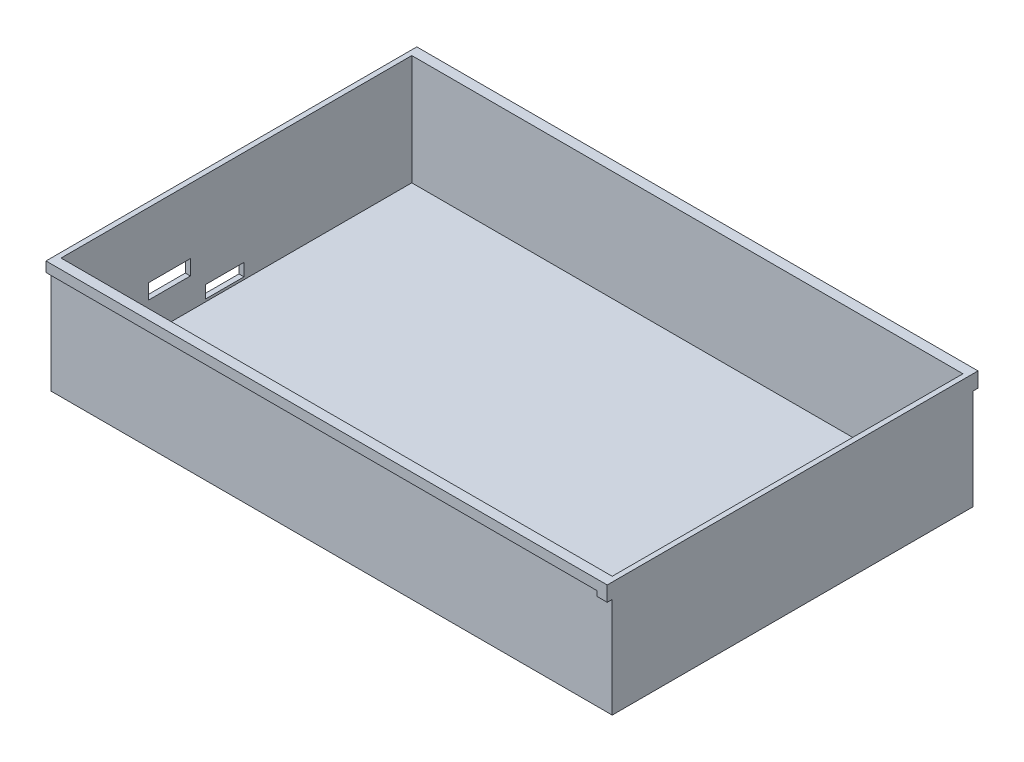
ISO-10303-21;
HEADER;
FILE_DESCRIPTION(('STEP AP214'),'2;1');
FILE_NAME('part.step','',(''),(''),'','','');
FILE_SCHEMA(('AUTOMOTIVE_DESIGN { 1 0 10303 214 1 1 1 1 }'));
ENDSEC;
DATA;
#1=APPLICATION_CONTEXT('core data for automotive mechanical design processes');
#2=APPLICATION_PROTOCOL_DEFINITION('international standard','automotive_design',2000,#1);
#3=PRODUCT_CONTEXT('',#1,'mechanical');
#4=PRODUCT('Part','Part','',(#3));
#5=PRODUCT_RELATED_PRODUCT_CATEGORY('part','',(#4));
#6=PRODUCT_DEFINITION_FORMATION('','',#4);
#7=PRODUCT_DEFINITION_CONTEXT('part definition',#1,'design');
#8=PRODUCT_DEFINITION('design','',#6,#7);
#9=PRODUCT_DEFINITION_SHAPE('','',#8);
#10=(LENGTH_UNIT() NAMED_UNIT(*) SI_UNIT(.MILLI.,.METRE.));
#11=(NAMED_UNIT(*) PLANE_ANGLE_UNIT() SI_UNIT($,.RADIAN.));
#12=(NAMED_UNIT(*) SI_UNIT($,.STERADIAN.) SOLID_ANGLE_UNIT());
#13=UNCERTAINTY_MEASURE_WITH_UNIT(LENGTH_MEASURE(1.E-05),#10,'distance_accuracy_value','');
#14=(GEOMETRIC_REPRESENTATION_CONTEXT(3) GLOBAL_UNCERTAINTY_ASSIGNED_CONTEXT((#13)) GLOBAL_UNIT_ASSIGNED_CONTEXT((#10,
#11,#12)) REPRESENTATION_CONTEXT('',''));
#15=CARTESIAN_POINT('',(0.,0.,0.));
#16=DIRECTION('',(0.,0.,1.));
#17=DIRECTION('',(1.,0.,0.));
#18=AXIS2_PLACEMENT_3D('',#15,#16,#17);
#19=CARTESIAN_POINT('',(0.,1.,0.));
#20=DIRECTION('',(0.,0.,-1.));
#21=DIRECTION('',(-1.,0.,0.));
#22=AXIS2_PLACEMENT_3D('',#19,#20,#21);
#23=PLANE('',#22);
#24=DIRECTION('',(1.,0.,0.));
#25=VECTOR('',#24,1.);
#26=CARTESIAN_POINT('',(112.,20.,0.));
#27=LINE('',#26,#25);
#28=CARTESIAN_POINT('',(110.,20.,0.));
#29=VERTEX_POINT('',#28);
#30=CARTESIAN_POINT('',(112.,20.,0.));
#31=VERTEX_POINT('',#30);
#32=EDGE_CURVE('E55',#29,#31,#27,.T.);
#33=ORIENTED_EDGE('',*,*,#32,.F.);
#34=DIRECTION('',(0.,-1.,0.));
#35=VECTOR('',#34,1.);
#36=CARTESIAN_POINT('',(110.,20.,0.));
#37=LINE('',#36,#35);
#38=CARTESIAN_POINT('',(110.,21.,0.));
#39=VERTEX_POINT('',#38);
#40=EDGE_CURVE('E242',#39,#29,#37,.T.);
#41=ORIENTED_EDGE('',*,*,#40,.F.);
#42=DIRECTION('',(1.,0.,0.));
#43=VECTOR('',#42,1.);
#44=CARTESIAN_POINT('',(110.,21.,0.));
#45=LINE('',#44,#43);
#46=CARTESIAN_POINT('',(0.,21.,0.));
#47=VERTEX_POINT('',#46);
#48=EDGE_CURVE('E61',#47,#39,#45,.T.);
#49=ORIENTED_EDGE('',*,*,#48,.F.);
#50=DIRECTION('',(0.,-1.,0.));
#51=VECTOR('',#50,1.);
#52=CARTESIAN_POINT('',(0.,1.,0.));
#53=LINE('',#52,#51);
#54=CARTESIAN_POINT('',(0.,0.,0.));
#55=VERTEX_POINT('',#54);
#56=EDGE_CURVE('E478',#47,#55,#53,.T.);
#57=ORIENTED_EDGE('',*,*,#56,.T.);
#58=DIRECTION('',(1.,0.,0.));
#59=VECTOR('',#58,1.);
#60=CARTESIAN_POINT('',(0.,0.,0.));
#61=LINE('',#60,#59);
#62=CARTESIAN_POINT('',(112.,0.,0.));
#63=VERTEX_POINT('',#62);
#64=EDGE_CURVE('E471',#55,#63,#61,.T.);
#65=ORIENTED_EDGE('',*,*,#64,.T.);
#66=DIRECTION('',(0.,-1.,0.));
#67=VECTOR('',#66,1.);
#68=CARTESIAN_POINT('',(112.,1.,0.));
#69=LINE('',#68,#67);
#70=EDGE_CURVE('E475',#31,#63,#69,.T.);
#71=ORIENTED_EDGE('',*,*,#70,.F.);
#72=EDGE_LOOP('',(#33,#41,#49,#57,#65,#71));
#73=FACE_BOUND('',#72,.T.);
#74=ADVANCED_FACE('F39',(#73),#23,.F.);
#75=CARTESIAN_POINT('',(1.,0.,0.));
#76=DIRECTION('',(1.,0.,0.));
#77=DIRECTION('',(0.,0.,-1.));
#78=AXIS2_PLACEMENT_3D('',#75,#76,#77);
#79=PLANE('',#78);
#80=DIRECTION('',(0.,0.,1.));
#81=VECTOR('',#80,1.);
#82=CARTESIAN_POINT('',(1.,1.50000000000001,0.));
#83=LINE('',#82,#81);
#84=CARTESIAN_POINT('',(1.,1.5,-37.5));
#85=VERTEX_POINT('',#84);
#86=CARTESIAN_POINT('',(1.,1.5,-29.8));
#87=VERTEX_POINT('',#86);
#88=EDGE_CURVE('E322',#85,#87,#83,.T.);
#89=ORIENTED_EDGE('',*,*,#88,.T.);
#90=DIRECTION('',(0.,1.,0.));
#91=VECTOR('',#90,1.);
#92=CARTESIAN_POINT('',(1.,0.,-29.8));
#93=LINE('',#92,#91);
#94=CARTESIAN_POINT('',(1.,4.,-29.8));
#95=VERTEX_POINT('',#94);
#96=EDGE_CURVE('E326',#87,#95,#93,.T.);
#97=ORIENTED_EDGE('',*,*,#96,.T.);
#98=DIRECTION('',(0.,0.,-1.));
#99=VECTOR('',#98,1.);
#100=CARTESIAN_POINT('',(1.,4.,0.));
#101=LINE('',#100,#99);
#102=CARTESIAN_POINT('',(1.,4.,-37.5));
#103=VERTEX_POINT('',#102);
#104=EDGE_CURVE('E331',#95,#103,#101,.T.);
#105=ORIENTED_EDGE('',*,*,#104,.T.);
#106=DIRECTION('',(0.,-1.,0.));
#107=VECTOR('',#106,1.);
#108=CARTESIAN_POINT('',(1.,0.,-37.5));
#109=LINE('',#108,#107);
#110=EDGE_CURVE('E335',#103,#85,#109,.T.);
#111=ORIENTED_EDGE('',*,*,#110,.T.);
#112=EDGE_LOOP('',(#89,#97,#105,#111));
#113=FACE_BOUND('',#112,.T.);
#114=DIRECTION('',(0.,0.,-1.));
#115=VECTOR('',#114,1.);
#116=CARTESIAN_POINT('',(1.,1.,0.));
#117=LINE('',#116,#115);
#118=CARTESIAN_POINT('',(1.,1.,-1.));
#119=VERTEX_POINT('',#118);
#120=CARTESIAN_POINT('',(1.,1.,-71.));
#121=VERTEX_POINT('',#120);
#122=EDGE_CURVE('E451',#119,#121,#117,.T.);
#123=ORIENTED_EDGE('',*,*,#122,.T.);
#124=DIRECTION('',(0.,1.,0.));
#125=VECTOR('',#124,1.);
#126=CARTESIAN_POINT('',(1.,0.,-71.));
#127=LINE('',#126,#125);
#128=CARTESIAN_POINT('',(1.,23.,-71.));
#129=VERTEX_POINT('',#128);
#130=EDGE_CURVE('E416',#121,#129,#127,.T.);
#131=ORIENTED_EDGE('',*,*,#130,.T.);
#132=DIRECTION('',(0.,0.,-1.));
#133=VECTOR('',#132,1.);
#134=CARTESIAN_POINT('',(1.,23.,0.));
#135=LINE('',#134,#133);
#136=CARTESIAN_POINT('',(1.,23.,-1.));
#137=VERTEX_POINT('',#136);
#138=EDGE_CURVE('E438',#137,#129,#135,.T.);
#139=ORIENTED_EDGE('',*,*,#138,.F.);
#140=DIRECTION('',(0.,1.,0.));
#141=VECTOR('',#140,1.);
#142=CARTESIAN_POINT('',(1.,0.,-1.));
#143=LINE('',#142,#141);
#144=EDGE_CURVE('E427',#119,#137,#143,.T.);
#145=ORIENTED_EDGE('',*,*,#144,.F.);
#146=EDGE_LOOP('',(#123,#131,#139,#145));
#147=FACE_BOUND('',#146,.T.);
#148=DIRECTION('',(0.,-1.,0.));
#149=VECTOR('',#148,1.);
#150=CARTESIAN_POINT('',(1.,0.,-18.5));
#151=LINE('',#150,#149);
#152=CARTESIAN_POINT('',(1.,10.,-18.5));
#153=VERTEX_POINT('',#152);
#154=CARTESIAN_POINT('',(1.,7.,-18.5));
#155=VERTEX_POINT('',#154);
#156=EDGE_CURVE('E379',#153,#155,#151,.T.);
#157=ORIENTED_EDGE('',*,*,#156,.F.);
#158=DIRECTION('',(0.,0.,1.));
#159=VECTOR('',#158,1.);
#160=CARTESIAN_POINT('',(1.,10.,0.));
#161=LINE('',#160,#159);
#162=CARTESIAN_POINT('',(1.,10.,-26.8));
#163=VERTEX_POINT('',#162);
#164=EDGE_CURVE('E368',#163,#153,#161,.T.);
#165=ORIENTED_EDGE('',*,*,#164,.F.);
#166=DIRECTION('',(0.,1.,0.));
#167=VECTOR('',#166,1.);
#168=CARTESIAN_POINT('',(1.,0.,-26.8));
#169=LINE('',#168,#167);
#170=CARTESIAN_POINT('',(1.,7.,-26.8));
#171=VERTEX_POINT('',#170);
#172=EDGE_CURVE('E371',#171,#163,#169,.T.);
#173=ORIENTED_EDGE('',*,*,#172,.F.);
#174=DIRECTION('',(0.,0.,-1.));
#175=VECTOR('',#174,1.);
#176=CARTESIAN_POINT('',(1.,7.,0.));
#177=LINE('',#176,#175);
#178=EDGE_CURVE('E375',#155,#171,#177,.T.);
#179=ORIENTED_EDGE('',*,*,#178,.F.);
#180=EDGE_LOOP('',(#157,#165,#173,#179));
#181=FACE_BOUND('',#180,.T.);
#182=ADVANCED_FACE('F505',(#113,#147,#181),#79,.T.);
#183=CARTESIAN_POINT('',(0.,1.,-72.));
#184=DIRECTION('',(1.,0.,0.));
#185=DIRECTION('',(0.,0.,-1.));
#186=AXIS2_PLACEMENT_3D('',#183,#184,#185);
#187=PLANE('',#186);
#188=DIRECTION('',(0.,0.,1.));
#189=VECTOR('',#188,1.);
#190=CARTESIAN_POINT('',(0.,21.,-73.));
#191=LINE('',#190,#189);
#192=CARTESIAN_POINT('',(0.,21.,-73.));
#193=VERTEX_POINT('',#192);
#194=CARTESIAN_POINT('',(0.,21.,-72.0067557104339));
#195=VERTEX_POINT('',#194);
#196=EDGE_CURVE('E296',#193,#195,#191,.T.);
#197=ORIENTED_EDGE('',*,*,#196,.T.);
#198=DIRECTION('',(0.,-0.999999948254399,0.000321700480205954));
#199=VECTOR('',#198,1.);
#200=CARTESIAN_POINT('',(0.,23.,-72.0073991114276));
#201=LINE('',#200,#199);
#202=CARTESIAN_POINT('',(0.,0.,-72.));
#203=VERTEX_POINT('',#202);
#204=EDGE_CURVE('E220',#195,#203,#201,.T.);
#205=ORIENTED_EDGE('',*,*,#204,.T.);
#206=DIRECTION('',(0.,0.,1.));
#207=VECTOR('',#206,1.);
#208=CARTESIAN_POINT('',(0.,0.,-72.));
#209=LINE('',#208,#207);
#210=EDGE_CURVE('E467',#203,#55,#209,.T.);
#211=ORIENTED_EDGE('',*,*,#210,.T.);
#212=ORIENTED_EDGE('',*,*,#56,.F.);
#213=DIRECTION('',(0.,0.,-1.));
#214=VECTOR('',#213,1.);
#215=CARTESIAN_POINT('',(0.,21.,1.));
#216=LINE('',#215,#214);
#217=CARTESIAN_POINT('',(0.,21.,1.));
#218=VERTEX_POINT('',#217);
#219=EDGE_CURVE('E229',#218,#47,#216,.T.);
#220=ORIENTED_EDGE('',*,*,#219,.F.);
#221=DIRECTION('',(0.,-1.,0.));
#222=VECTOR('',#221,1.);
#223=CARTESIAN_POINT('',(0.,21.,1.));
#224=LINE('',#223,#222);
#225=CARTESIAN_POINT('',(0.,23.,1.));
#226=VERTEX_POINT('',#225);
#227=EDGE_CURVE('E224',#226,#218,#224,.T.);
#228=ORIENTED_EDGE('',*,*,#227,.F.);
#229=DIRECTION('',(0.,0.,-1.));
#230=VECTOR('',#229,1.);
#231=CARTESIAN_POINT('',(0.,23.,0.));
#232=LINE('',#231,#230);
#233=CARTESIAN_POINT('',(0.,23.,-73.));
#234=VERTEX_POINT('',#233);
#235=EDGE_CURVE('E208',#226,#234,#232,.T.);
#236=ORIENTED_EDGE('',*,*,#235,.T.);
#237=DIRECTION('',(0.,-1.,0.));
#238=VECTOR('',#237,1.);
#239=CARTESIAN_POINT('',(0.,23.,-73.));
#240=LINE('',#239,#238);
#241=EDGE_CURVE('E281',#234,#193,#240,.T.);
#242=ORIENTED_EDGE('',*,*,#241,.T.);
#243=EDGE_LOOP('',(#197,#205,#211,#212,#220,#228,#236,#242));
#244=FACE_BOUND('',#243,.T.);
#245=DIRECTION('',(0.,1.,0.));
#246=VECTOR('',#245,1.);
#247=CARTESIAN_POINT('',(0.,0.,-29.8));
#248=LINE('',#247,#246);
#249=CARTESIAN_POINT('',(0.,1.5,-29.8));
#250=VERTEX_POINT('',#249);
#251=CARTESIAN_POINT('',(0.,4.,-29.8));
#252=VERTEX_POINT('',#251);
#253=EDGE_CURVE('E343',#250,#252,#248,.T.);
#254=ORIENTED_EDGE('',*,*,#253,.F.);
#255=DIRECTION('',(0.,0.,1.));
#256=VECTOR('',#255,1.);
#257=CARTESIAN_POINT('',(0.,1.50000000000001,0.));
#258=LINE('',#257,#256);
#259=CARTESIAN_POINT('',(0.,1.5,-37.5));
#260=VERTEX_POINT('',#259);
#261=EDGE_CURVE('E340',#260,#250,#258,.T.);
#262=ORIENTED_EDGE('',*,*,#261,.F.);
#263=DIRECTION('',(0.,-1.,0.));
#264=VECTOR('',#263,1.);
#265=CARTESIAN_POINT('',(0.,0.,-37.5));
#266=LINE('',#265,#264);
#267=CARTESIAN_POINT('',(0.,4.,-37.5));
#268=VERTEX_POINT('',#267);
#269=EDGE_CURVE('E327',#268,#260,#266,.T.);
#270=ORIENTED_EDGE('',*,*,#269,.F.);
#271=DIRECTION('',(0.,0.,-1.));
#272=VECTOR('',#271,1.);
#273=CARTESIAN_POINT('',(0.,4.,0.));
#274=LINE('',#273,#272);
#275=EDGE_CURVE('E348',#252,#268,#274,.T.);
#276=ORIENTED_EDGE('',*,*,#275,.F.);
#277=EDGE_LOOP('',(#254,#262,#270,#276));
#278=FACE_BOUND('',#277,.T.);
#279=DIRECTION('',(0.,0.,1.));
#280=VECTOR('',#279,1.);
#281=CARTESIAN_POINT('',(0.,10.,0.));
#282=LINE('',#281,#280);
#283=CARTESIAN_POINT('',(0.,10.,-26.8));
#284=VERTEX_POINT('',#283);
#285=CARTESIAN_POINT('',(0.,10.,-18.5));
#286=VERTEX_POINT('',#285);
#287=EDGE_CURVE('E321',#284,#286,#282,.T.);
#288=ORIENTED_EDGE('',*,*,#287,.T.);
#289=DIRECTION('',(0.,-1.,0.));
#290=VECTOR('',#289,1.);
#291=CARTESIAN_POINT('',(0.,0.,-18.5));
#292=LINE('',#291,#290);
#293=CARTESIAN_POINT('',(0.,7.,-18.5));
#294=VERTEX_POINT('',#293);
#295=EDGE_CURVE('E372',#286,#294,#292,.T.);
#296=ORIENTED_EDGE('',*,*,#295,.T.);
#297=DIRECTION('',(0.,0.,-1.));
#298=VECTOR('',#297,1.);
#299=CARTESIAN_POINT('',(0.,7.,0.));
#300=LINE('',#299,#298);
#301=CARTESIAN_POINT('',(0.,7.,-26.8));
#302=VERTEX_POINT('',#301);
#303=EDGE_CURVE('E390',#294,#302,#300,.T.);
#304=ORIENTED_EDGE('',*,*,#303,.T.);
#305=DIRECTION('',(0.,1.,0.));
#306=VECTOR('',#305,1.);
#307=CARTESIAN_POINT('',(0.,0.,-26.8));
#308=LINE('',#307,#306);
#309=EDGE_CURVE('E386',#302,#284,#308,.T.);
#310=ORIENTED_EDGE('',*,*,#309,.T.);
#311=EDGE_LOOP('',(#288,#296,#304,#310));
#312=FACE_BOUND('',#311,.T.);
#313=ADVANCED_FACE('F226',(#244,#278,#312),#187,.F.);
#314=CARTESIAN_POINT('',(0.,1.,0.));
#315=DIRECTION('',(0.,1.,0.));
#316=DIRECTION('',(0.,0.,1.));
#317=AXIS2_PLACEMENT_3D('',#314,#315,#316);
#318=PLANE('',#317);
#319=DIRECTION('',(0.,0.,1.));
#320=VECTOR('',#319,1.);
#321=CARTESIAN_POINT('',(111.,1.,0.));
#322=LINE('',#321,#320);
#323=CARTESIAN_POINT('',(111.,1.,-71.));
#324=VERTEX_POINT('',#323);
#325=CARTESIAN_POINT('',(111.,1.,-1.));
#326=VERTEX_POINT('',#325);
#327=EDGE_CURVE('E221',#324,#326,#322,.T.);
#328=ORIENTED_EDGE('',*,*,#327,.F.);
#329=DIRECTION('',(-1.,0.,0.));
#330=VECTOR('',#329,1.);
#331=CARTESIAN_POINT('',(0.,1.,-71.));
#332=LINE('',#331,#330);
#333=EDGE_CURVE('E412',#324,#121,#332,.T.);
#334=ORIENTED_EDGE('',*,*,#333,.T.);
#335=ORIENTED_EDGE('',*,*,#122,.F.);
#336=DIRECTION('',(-1.,0.,0.));
#337=VECTOR('',#336,1.);
#338=CARTESIAN_POINT('',(0.,1.,-1.));
#339=LINE('',#338,#337);
#340=EDGE_CURVE('E424',#326,#119,#339,.T.);
#341=ORIENTED_EDGE('',*,*,#340,.F.);
#342=EDGE_LOOP('',(#328,#334,#335,#341));
#343=FACE_BOUND('',#342,.T.);
#344=ADVANCED_FACE('F497',(#343),#318,.T.);
#345=CARTESIAN_POINT('',(111.,0.,0.));
#346=DIRECTION('',(-1.,0.,0.));
#347=DIRECTION('',(0.,0.,1.));
#348=AXIS2_PLACEMENT_3D('',#345,#346,#347);
#349=PLANE('',#348);
#350=DIRECTION('',(0.,0.,1.));
#351=VECTOR('',#350,1.);
#352=CARTESIAN_POINT('',(111.,23.,0.));
#353=LINE('',#352,#351);
#354=CARTESIAN_POINT('',(111.,23.,-71.));
#355=VERTEX_POINT('',#354);
#356=CARTESIAN_POINT('',(111.,23.,-1.));
#357=VERTEX_POINT('',#356);
#358=EDGE_CURVE('E431',#355,#357,#353,.T.);
#359=ORIENTED_EDGE('',*,*,#358,.F.);
#360=DIRECTION('',(0.,-1.,0.));
#361=VECTOR('',#360,1.);
#362=CARTESIAN_POINT('',(111.,0.,-71.));
#363=LINE('',#362,#361);
#364=EDGE_CURVE('E48',#355,#324,#363,.T.);
#365=ORIENTED_EDGE('',*,*,#364,.T.);
#366=ORIENTED_EDGE('',*,*,#327,.T.);
#367=DIRECTION('',(0.,-1.,0.));
#368=VECTOR('',#367,1.);
#369=CARTESIAN_POINT('',(111.,0.,-1.));
#370=LINE('',#369,#368);
#371=EDGE_CURVE('E484',#357,#326,#370,.T.);
#372=ORIENTED_EDGE('',*,*,#371,.F.);
#373=EDGE_LOOP('',(#359,#365,#366,#372));
#374=FACE_BOUND('',#373,.T.);
#375=ADVANCED_FACE('F492',(#374),#349,.T.);
#376=CARTESIAN_POINT('',(112.,1.,0.));
#377=DIRECTION('',(-1.,0.,0.));
#378=DIRECTION('',(0.,0.,1.));
#379=AXIS2_PLACEMENT_3D('',#376,#377,#378);
#380=PLANE('',#379);
#381=DIRECTION('',(0.,0.,1.));
#382=VECTOR('',#381,1.);
#383=CARTESIAN_POINT('',(112.,23.,0.));
#384=LINE('',#383,#382);
#385=CARTESIAN_POINT('',(112.,23.,-73.));
#386=VERTEX_POINT('',#385);
#387=CARTESIAN_POINT('',(112.,23.,1.));
#388=VERTEX_POINT('',#387);
#389=EDGE_CURVE('E430',#386,#388,#384,.T.);
#390=ORIENTED_EDGE('',*,*,#389,.T.);
#391=DIRECTION('',(0.,1.,0.));
#392=VECTOR('',#391,1.);
#393=CARTESIAN_POINT('',(112.,23.,1.));
#394=LINE('',#393,#392);
#395=CARTESIAN_POINT('',(112.,20.,1.));
#396=VERTEX_POINT('',#395);
#397=EDGE_CURVE('E238',#396,#388,#394,.T.);
#398=ORIENTED_EDGE('',*,*,#397,.F.);
#399=DIRECTION('',(0.,0.,-1.));
#400=VECTOR('',#399,1.);
#401=CARTESIAN_POINT('',(112.,20.,1.));
#402=LINE('',#401,#400);
#403=EDGE_CURVE('E255',#396,#31,#402,.T.);
#404=ORIENTED_EDGE('',*,*,#403,.T.);
#405=ORIENTED_EDGE('',*,*,#70,.T.);
#406=DIRECTION('',(0.,0.,-1.));
#407=VECTOR('',#406,1.);
#408=CARTESIAN_POINT('',(112.,0.,0.));
#409=LINE('',#408,#407);
#410=CARTESIAN_POINT('',(112.,0.,-72.));
#411=VERTEX_POINT('',#410);
#412=EDGE_CURVE('E459',#63,#411,#409,.T.);
#413=ORIENTED_EDGE('',*,*,#412,.T.);
#414=DIRECTION('',(0.,-1.,0.));
#415=VECTOR('',#414,1.);
#416=CARTESIAN_POINT('',(112.,1.,-72.));
#417=LINE('',#416,#415);
#418=CARTESIAN_POINT('',(112.,20.,-72.));
#419=VERTEX_POINT('',#418);
#420=EDGE_CURVE('E481',#419,#411,#417,.T.);
#421=ORIENTED_EDGE('',*,*,#420,.F.);
#422=DIRECTION('',(0.,0.,1.));
#423=VECTOR('',#422,1.);
#424=CARTESIAN_POINT('',(112.,20.,-73.));
#425=LINE('',#424,#423);
#426=CARTESIAN_POINT('',(112.,20.,-73.));
#427=VERTEX_POINT('',#426);
#428=EDGE_CURVE('E307',#427,#419,#425,.T.);
#429=ORIENTED_EDGE('',*,*,#428,.F.);
#430=DIRECTION('',(0.,1.,0.));
#431=VECTOR('',#430,1.);
#432=CARTESIAN_POINT('',(112.,20.,-73.));
#433=LINE('',#432,#431);
#434=EDGE_CURVE('E274',#427,#386,#433,.T.);
#435=ORIENTED_EDGE('',*,*,#434,.T.);
#436=EDGE_LOOP('',(#390,#398,#404,#405,#413,#421,#429,#435));
#437=FACE_BOUND('',#436,.T.);
#438=ADVANCED_FACE('F41',(#437),#380,.F.);
#439=CARTESIAN_POINT('',(112.,1.,-72.));
#440=DIRECTION('',(0.,0.,1.));
#441=DIRECTION('',(1.,0.,0.));
#442=AXIS2_PLACEMENT_3D('',#439,#440,#441);
#443=PLANE('',#442);
#444=DIRECTION('',(0.,-1.,0.));
#445=VECTOR('',#444,1.);
#446=CARTESIAN_POINT('',(110.,21.,-72.));
#447=LINE('',#446,#445);
#448=CARTESIAN_POINT('',(110.,21.,-72.));
#449=VERTEX_POINT('',#448);
#450=CARTESIAN_POINT('',(110.,20.,-72.));
#451=VERTEX_POINT('',#450);
#452=EDGE_CURVE('E300',#449,#451,#447,.T.);
#453=ORIENTED_EDGE('',*,*,#452,.T.);
#454=DIRECTION('',(1.,0.,0.));
#455=VECTOR('',#454,1.);
#456=CARTESIAN_POINT('',(110.,20.,-72.));
#457=LINE('',#456,#455);
#458=EDGE_CURVE('E278',#451,#419,#457,.T.);
#459=ORIENTED_EDGE('',*,*,#458,.T.);
#460=ORIENTED_EDGE('',*,*,#420,.T.);
#461=DIRECTION('',(-1.,0.,0.));
#462=VECTOR('',#461,1.);
#463=CARTESIAN_POINT('',(112.,0.,-72.));
#464=LINE('',#463,#462);
#465=CARTESIAN_POINT('',(1.00000000000003,0.,-72.));
#466=VERTEX_POINT('',#465);
#467=EDGE_CURVE('E463',#411,#466,#464,.T.);
#468=ORIENTED_EDGE('',*,*,#467,.T.);
#469=DIRECTION('',(0.,1.,0.));
#470=VECTOR('',#469,1.);
#471=CARTESIAN_POINT('',(1.,1.,-72.));
#472=LINE('',#471,#470);
#473=CARTESIAN_POINT('',(1.,21.,-72.));
#474=VERTEX_POINT('',#473);
#475=EDGE_CURVE('E455',#466,#474,#472,.T.);
#476=ORIENTED_EDGE('',*,*,#475,.T.);
#477=DIRECTION('',(1.,0.,0.));
#478=VECTOR('',#477,1.);
#479=CARTESIAN_POINT('',(0.,21.,-72.));
#480=LINE('',#479,#478);
#481=EDGE_CURVE('E273',#474,#449,#480,.T.);
#482=ORIENTED_EDGE('',*,*,#481,.T.);
#483=EDGE_LOOP('',(#453,#459,#460,#468,#476,#482));
#484=FACE_BOUND('',#483,.T.);
#485=ADVANCED_FACE('F533',(#484),#443,.F.);
#486=CARTESIAN_POINT('',(0.,0.,0.));
#487=DIRECTION('',(0.,1.,0.));
#488=DIRECTION('',(0.,0.,1.));
#489=AXIS2_PLACEMENT_3D('',#486,#487,#488);
#490=PLANE('',#489);
#491=ORIENTED_EDGE('',*,*,#467,.F.);
#492=ORIENTED_EDGE('',*,*,#412,.F.);
#493=ORIENTED_EDGE('',*,*,#64,.F.);
#494=ORIENTED_EDGE('',*,*,#210,.F.);
#495=DIRECTION('',(-1.,0.,0.));
#496=VECTOR('',#495,1.);
#497=CARTESIAN_POINT('',(1.,0.,-72.));
#498=LINE('',#497,#496);
#499=EDGE_CURVE('E444',#466,#203,#498,.T.);
#500=ORIENTED_EDGE('',*,*,#499,.F.);
#501=EDGE_LOOP('',(#491,#492,#493,#494,#500));
#502=FACE_BOUND('',#501,.T.);
#503=ADVANCED_FACE('F530',(#502),#490,.F.);
#504=DIRECTION('',(0.,0.,-1.));
#505=VECTOR('',#504,1.);
#506=CARTESIAN_POINT('',(1.,21.,0.));
#507=LINE('',#506,#505);
#508=CARTESIAN_POINT('',(1.,21.,-72.0067557104339));
#509=VERTEX_POINT('',#508);
#510=EDGE_CURVE('E310',#474,#509,#507,.T.);
#511=ORIENTED_EDGE('',*,*,#510,.F.);
#512=ORIENTED_EDGE('',*,*,#475,.F.);
#513=DIRECTION('',(0.,-0.999999948254399,0.000321700480205954));
#514=VECTOR('',#513,1.);
#515=CARTESIAN_POINT('',(1.,23.,-72.0073991114276));
#516=LINE('',#515,#514);
#517=EDGE_CURVE('E442',#509,#466,#516,.T.);
#518=ORIENTED_EDGE('',*,*,#517,.F.);
#519=EDGE_LOOP('',(#511,#512,#518));
#520=FACE_BOUND('',#519,.T.);
#521=ADVANCED_FACE('F527',(#520),#79,.T.);
#522=CARTESIAN_POINT('',(1.,23.,0.));
#523=DIRECTION('',(0.,1.,0.));
#524=DIRECTION('',(0.,0.,1.));
#525=AXIS2_PLACEMENT_3D('',#522,#523,#524);
#526=PLANE('',#525);
#527=DIRECTION('',(-1.,0.,0.));
#528=VECTOR('',#527,1.);
#529=CARTESIAN_POINT('',(112.,23.,-73.));
#530=LINE('',#529,#528);
#531=EDGE_CURVE('E215',#386,#234,#530,.T.);
#532=ORIENTED_EDGE('',*,*,#531,.T.);
#533=ORIENTED_EDGE('',*,*,#235,.F.);
#534=DIRECTION('',(-1.,0.,0.));
#535=VECTOR('',#534,1.);
#536=CARTESIAN_POINT('',(0.,23.,1.));
#537=LINE('',#536,#535);
#538=EDGE_CURVE('E213',#388,#226,#537,.T.);
#539=ORIENTED_EDGE('',*,*,#538,.F.);
#540=ORIENTED_EDGE('',*,*,#389,.F.);
#541=EDGE_LOOP('',(#532,#533,#539,#540));
#542=FACE_BOUND('',#541,.T.);
#543=ORIENTED_EDGE('',*,*,#138,.T.);
#544=DIRECTION('',(1.,0.,0.));
#545=VECTOR('',#544,1.);
#546=CARTESIAN_POINT('',(0.,23.,-71.));
#547=LINE('',#546,#545);
#548=EDGE_CURVE('E358',#129,#355,#547,.T.);
#549=ORIENTED_EDGE('',*,*,#548,.T.);
#550=ORIENTED_EDGE('',*,*,#358,.T.);
#551=DIRECTION('',(1.,0.,0.));
#552=VECTOR('',#551,1.);
#553=CARTESIAN_POINT('',(0.,23.,-1.));
#554=LINE('',#553,#552);
#555=EDGE_CURVE('E420',#137,#357,#554,.T.);
#556=ORIENTED_EDGE('',*,*,#555,.F.);
#557=EDGE_LOOP('',(#543,#549,#550,#556));
#558=FACE_BOUND('',#557,.T.);
#559=ADVANCED_FACE('F210',(#542,#558),#526,.T.);
#560=CARTESIAN_POINT('',(1.,23.,-72.0073991114276));
#561=DIRECTION('',(0.,-0.000321700480205954,-0.999999948254399));
#562=DIRECTION('',(0.,0.999999948254399,-0.000321700480205954));
#563=AXIS2_PLACEMENT_3D('',#560,#561,#562);
#564=PLANE('',#563);
#565=DIRECTION('',(-1.,0.,0.));
#566=VECTOR('',#565,1.);
#567=CARTESIAN_POINT('',(1.,21.,-72.0067557104339));
#568=LINE('',#567,#566);
#569=EDGE_CURVE('E11',#509,#195,#568,.T.);
#570=ORIENTED_EDGE('',*,*,#569,.F.);
#571=ORIENTED_EDGE('',*,*,#517,.T.);
#572=ORIENTED_EDGE('',*,*,#499,.T.);
#573=ORIENTED_EDGE('',*,*,#204,.F.);
#574=EDGE_LOOP('',(#570,#571,#572,#573));
#575=FACE_BOUND('',#574,.T.);
#576=ADVANCED_FACE('F518',(#575),#564,.T.);
#577=CARTESIAN_POINT('',(0.,0.,-1.));
#578=DIRECTION('',(0.,0.,-1.));
#579=DIRECTION('',(-1.,0.,0.));
#580=AXIS2_PLACEMENT_3D('',#577,#578,#579);
#581=PLANE('',#580);
#582=ORIENTED_EDGE('',*,*,#340,.T.);
#583=ORIENTED_EDGE('',*,*,#144,.T.);
#584=ORIENTED_EDGE('',*,*,#555,.T.);
#585=ORIENTED_EDGE('',*,*,#371,.T.);
#586=EDGE_LOOP('',(#582,#583,#584,#585));
#587=FACE_BOUND('',#586,.T.);
#588=ADVANCED_FACE('F501',(#587),#581,.T.);
#589=CARTESIAN_POINT('',(0.,0.,-71.));
#590=DIRECTION('',(0.,0.,-1.));
#591=DIRECTION('',(-1.,0.,0.));
#592=AXIS2_PLACEMENT_3D('',#589,#590,#591);
#593=PLANE('',#592);
#594=ORIENTED_EDGE('',*,*,#130,.F.);
#595=ORIENTED_EDGE('',*,*,#333,.F.);
#596=ORIENTED_EDGE('',*,*,#364,.F.);
#597=ORIENTED_EDGE('',*,*,#548,.F.);
#598=EDGE_LOOP('',(#594,#595,#596,#597));
#599=FACE_BOUND('',#598,.T.);
#600=ADVANCED_FACE('F507',(#599),#593,.F.);
#601=CARTESIAN_POINT('',(1.,10.,0.));
#602=DIRECTION('',(0.,-1.,0.));
#603=DIRECTION('',(0.,0.,-1.));
#604=AXIS2_PLACEMENT_3D('',#601,#602,#603);
#605=PLANE('',#604);
#606=ORIENTED_EDGE('',*,*,#287,.F.);
#607=DIRECTION('',(-1.,0.,0.));
#608=VECTOR('',#607,1.);
#609=CARTESIAN_POINT('',(1.,10.,-26.8));
#610=LINE('',#609,#608);
#611=EDGE_CURVE('E382',#163,#284,#610,.T.);
#612=ORIENTED_EDGE('',*,*,#611,.F.);
#613=ORIENTED_EDGE('',*,*,#164,.T.);
#614=DIRECTION('',(-1.,0.,0.));
#615=VECTOR('',#614,1.);
#616=CARTESIAN_POINT('',(1.,10.,-18.5));
#617=LINE('',#616,#615);
#618=EDGE_CURVE('E344',#153,#286,#617,.T.);
#619=ORIENTED_EDGE('',*,*,#618,.T.);
#620=EDGE_LOOP('',(#606,#612,#613,#619));
#621=FACE_BOUND('',#620,.T.);
#622=ADVANCED_FACE('F509',(#621),#605,.T.);
#623=CARTESIAN_POINT('',(1.,0.,-18.5));
#624=DIRECTION('',(0.,0.,-1.));
#625=DIRECTION('',(-1.,0.,0.));
#626=AXIS2_PLACEMENT_3D('',#623,#624,#625);
#627=PLANE('',#626);
#628=ORIENTED_EDGE('',*,*,#295,.F.);
#629=ORIENTED_EDGE('',*,*,#618,.F.);
#630=ORIENTED_EDGE('',*,*,#156,.T.);
#631=DIRECTION('',(-1.,0.,0.));
#632=VECTOR('',#631,1.);
#633=CARTESIAN_POINT('',(1.,7.,-18.5));
#634=LINE('',#633,#632);
#635=EDGE_CURVE('E400',#155,#294,#634,.T.);
#636=ORIENTED_EDGE('',*,*,#635,.T.);
#637=EDGE_LOOP('',(#628,#629,#630,#636));
#638=FACE_BOUND('',#637,.T.);
#639=ADVANCED_FACE('F515',(#638),#627,.T.);
#640=CARTESIAN_POINT('',(1.,7.,0.));
#641=DIRECTION('',(0.,1.,0.));
#642=DIRECTION('',(0.,0.,1.));
#643=AXIS2_PLACEMENT_3D('',#640,#641,#642);
#644=PLANE('',#643);
#645=ORIENTED_EDGE('',*,*,#303,.F.);
#646=ORIENTED_EDGE('',*,*,#635,.F.);
#647=ORIENTED_EDGE('',*,*,#178,.T.);
#648=DIRECTION('',(-1.,0.,0.));
#649=VECTOR('',#648,1.);
#650=CARTESIAN_POINT('',(1.,7.,-26.8));
#651=LINE('',#650,#649);
#652=EDGE_CURVE('E403',#171,#302,#651,.T.);
#653=ORIENTED_EDGE('',*,*,#652,.T.);
#654=EDGE_LOOP('',(#645,#646,#647,#653));
#655=FACE_BOUND('',#654,.T.);
#656=ADVANCED_FACE('F618',(#655),#644,.T.);
#657=CARTESIAN_POINT('',(1.,0.,-26.8));
#658=DIRECTION('',(0.,0.,1.));
#659=DIRECTION('',(1.,0.,0.));
#660=AXIS2_PLACEMENT_3D('',#657,#658,#659);
#661=PLANE('',#660);
#662=ORIENTED_EDGE('',*,*,#309,.F.);
#663=ORIENTED_EDGE('',*,*,#652,.F.);
#664=ORIENTED_EDGE('',*,*,#172,.T.);
#665=ORIENTED_EDGE('',*,*,#611,.T.);
#666=EDGE_LOOP('',(#662,#663,#664,#665));
#667=FACE_BOUND('',#666,.T.);
#668=ADVANCED_FACE('F614',(#667),#661,.T.);
#669=CARTESIAN_POINT('',(1.,1.50000000000001,0.));
#670=DIRECTION('',(0.,-1.,0.));
#671=DIRECTION('',(0.,0.,-1.));
#672=AXIS2_PLACEMENT_3D('',#669,#670,#671);
#673=PLANE('',#672);
#674=ORIENTED_EDGE('',*,*,#261,.T.);
#675=DIRECTION('',(-1.,0.,0.));
#676=VECTOR('',#675,1.);
#677=CARTESIAN_POINT('',(1.,1.5,-29.8));
#678=LINE('',#677,#676);
#679=EDGE_CURVE('E339',#87,#250,#678,.T.);
#680=ORIENTED_EDGE('',*,*,#679,.F.);
#681=ORIENTED_EDGE('',*,*,#88,.F.);
#682=DIRECTION('',(-1.,0.,0.));
#683=VECTOR('',#682,1.);
#684=CARTESIAN_POINT('',(1.,1.5,-37.5));
#685=LINE('',#684,#683);
#686=EDGE_CURVE('E355',#85,#260,#685,.T.);
#687=ORIENTED_EDGE('',*,*,#686,.T.);
#688=EDGE_LOOP('',(#674,#680,#681,#687));
#689=FACE_BOUND('',#688,.T.);
#690=ADVANCED_FACE('F604',(#689),#673,.F.);
#691=CARTESIAN_POINT('',(1.,0.,-37.5));
#692=DIRECTION('',(0.,0.,-1.));
#693=DIRECTION('',(-1.,0.,0.));
#694=AXIS2_PLACEMENT_3D('',#691,#692,#693);
#695=PLANE('',#694);
#696=ORIENTED_EDGE('',*,*,#269,.T.);
#697=ORIENTED_EDGE('',*,*,#686,.F.);
#698=ORIENTED_EDGE('',*,*,#110,.F.);
#699=DIRECTION('',(-1.,0.,0.));
#700=VECTOR('',#699,1.);
#701=CARTESIAN_POINT('',(1.,4.,-37.5));
#702=LINE('',#701,#700);
#703=EDGE_CURVE('E359',#103,#268,#702,.T.);
#704=ORIENTED_EDGE('',*,*,#703,.T.);
#705=EDGE_LOOP('',(#696,#697,#698,#704));
#706=FACE_BOUND('',#705,.T.);
#707=ADVANCED_FACE('F600',(#706),#695,.F.);
#708=CARTESIAN_POINT('',(1.,4.,0.));
#709=DIRECTION('',(0.,1.,0.));
#710=DIRECTION('',(0.,0.,1.));
#711=AXIS2_PLACEMENT_3D('',#708,#709,#710);
#712=PLANE('',#711);
#713=ORIENTED_EDGE('',*,*,#275,.T.);
#714=ORIENTED_EDGE('',*,*,#703,.F.);
#715=ORIENTED_EDGE('',*,*,#104,.F.);
#716=DIRECTION('',(-1.,0.,0.));
#717=VECTOR('',#716,1.);
#718=CARTESIAN_POINT('',(1.,4.,-29.8));
#719=LINE('',#718,#717);
#720=EDGE_CURVE('E362',#95,#252,#719,.T.);
#721=ORIENTED_EDGE('',*,*,#720,.T.);
#722=EDGE_LOOP('',(#713,#714,#715,#721));
#723=FACE_BOUND('',#722,.T.);
#724=ADVANCED_FACE('F603',(#723),#712,.F.);
#725=CARTESIAN_POINT('',(1.,0.,-29.8));
#726=DIRECTION('',(0.,0.,1.));
#727=DIRECTION('',(0.,-1.,0.));
#728=AXIS2_PLACEMENT_3D('',#725,#726,#727);
#729=PLANE('',#728);
#730=ORIENTED_EDGE('',*,*,#253,.T.);
#731=ORIENTED_EDGE('',*,*,#720,.F.);
#732=ORIENTED_EDGE('',*,*,#96,.F.);
#733=ORIENTED_EDGE('',*,*,#679,.T.);
#734=EDGE_LOOP('',(#730,#731,#732,#733));
#735=FACE_BOUND('',#734,.T.);
#736=ADVANCED_FACE('F595',(#735),#729,.F.);
#737=CARTESIAN_POINT('',(110.,20.,-73.));
#738=DIRECTION('',(0.,-1.,0.));
#739=DIRECTION('',(0.,0.,-1.));
#740=AXIS2_PLACEMENT_3D('',#737,#738,#739);
#741=PLANE('',#740);
#742=ORIENTED_EDGE('',*,*,#458,.F.);
#743=DIRECTION('',(0.,0.,1.));
#744=VECTOR('',#743,1.);
#745=CARTESIAN_POINT('',(110.,20.,-73.));
#746=LINE('',#745,#744);
#747=CARTESIAN_POINT('',(110.,20.,-73.));
#748=VERTEX_POINT('',#747);
#749=EDGE_CURVE('E311',#748,#451,#746,.T.);
#750=ORIENTED_EDGE('',*,*,#749,.F.);
#751=DIRECTION('',(1.,0.,0.));
#752=VECTOR('',#751,1.);
#753=CARTESIAN_POINT('',(110.,20.,-73.));
#754=LINE('',#753,#752);
#755=EDGE_CURVE('E292',#748,#427,#754,.T.);
#756=ORIENTED_EDGE('',*,*,#755,.T.);
#757=ORIENTED_EDGE('',*,*,#428,.T.);
#758=EDGE_LOOP('',(#742,#750,#756,#757));
#759=FACE_BOUND('',#758,.T.);
#760=ADVANCED_FACE('F550',(#759),#741,.T.);
#761=CARTESIAN_POINT('',(110.,21.,-73.));
#762=DIRECTION('',(-1.,0.,0.));
#763=DIRECTION('',(0.,0.,1.));
#764=AXIS2_PLACEMENT_3D('',#761,#762,#763);
#765=PLANE('',#764);
#766=ORIENTED_EDGE('',*,*,#452,.F.);
#767=DIRECTION('',(0.,0.,1.));
#768=VECTOR('',#767,1.);
#769=CARTESIAN_POINT('',(110.,21.,-73.));
#770=LINE('',#769,#768);
#771=CARTESIAN_POINT('',(110.,21.,-73.));
#772=VERTEX_POINT('',#771);
#773=EDGE_CURVE('E314',#772,#449,#770,.T.);
#774=ORIENTED_EDGE('',*,*,#773,.F.);
#775=DIRECTION('',(0.,-1.,0.));
#776=VECTOR('',#775,1.);
#777=CARTESIAN_POINT('',(110.,21.,-73.));
#778=LINE('',#777,#776);
#779=EDGE_CURVE('E288',#772,#748,#778,.T.);
#780=ORIENTED_EDGE('',*,*,#779,.T.);
#781=ORIENTED_EDGE('',*,*,#749,.T.);
#782=EDGE_LOOP('',(#766,#774,#780,#781));
#783=FACE_BOUND('',#782,.T.);
#784=ADVANCED_FACE('F546',(#783),#765,.T.);
#785=CARTESIAN_POINT('',(0.,21.,-73.));
#786=DIRECTION('',(0.,-1.,0.));
#787=DIRECTION('',(0.,0.,-1.));
#788=AXIS2_PLACEMENT_3D('',#785,#786,#787);
#789=PLANE('',#788);
#790=ORIENTED_EDGE('',*,*,#481,.F.);
#791=ORIENTED_EDGE('',*,*,#510,.T.);
#792=ORIENTED_EDGE('',*,*,#569,.T.);
#793=ORIENTED_EDGE('',*,*,#196,.F.);
#794=DIRECTION('',(1.,0.,0.));
#795=VECTOR('',#794,1.);
#796=CARTESIAN_POINT('',(0.,21.,-73.));
#797=LINE('',#796,#795);
#798=EDGE_CURVE('E284',#193,#772,#797,.T.);
#799=ORIENTED_EDGE('',*,*,#798,.T.);
#800=ORIENTED_EDGE('',*,*,#773,.T.);
#801=EDGE_LOOP('',(#790,#791,#792,#793,#799,#800));
#802=FACE_BOUND('',#801,.T.);
#803=ADVANCED_FACE('F592',(#802),#789,.T.);
#804=CARTESIAN_POINT('',(0.,0.,-73.));
#805=DIRECTION('',(0.,0.,1.));
#806=DIRECTION('',(1.,0.,0.));
#807=AXIS2_PLACEMENT_3D('',#804,#805,#806);
#808=PLANE('',#807);
#809=ORIENTED_EDGE('',*,*,#434,.F.);
#810=ORIENTED_EDGE('',*,*,#755,.F.);
#811=ORIENTED_EDGE('',*,*,#779,.F.);
#812=ORIENTED_EDGE('',*,*,#798,.F.);
#813=ORIENTED_EDGE('',*,*,#241,.F.);
#814=ORIENTED_EDGE('',*,*,#531,.F.);
#815=EDGE_LOOP('',(#809,#810,#811,#812,#813,#814));
#816=FACE_BOUND('',#815,.T.);
#817=ADVANCED_FACE('F553',(#816),#808,.F.);
#818=CARTESIAN_POINT('',(110.,21.,1.));
#819=DIRECTION('',(0.,1.,0.));
#820=DIRECTION('',(-1.,0.,0.));
#821=AXIS2_PLACEMENT_3D('',#818,#819,#820);
#822=PLANE('',#821);
#823=ORIENTED_EDGE('',*,*,#48,.T.);
#824=DIRECTION('',(0.,0.,-1.));
#825=VECTOR('',#824,1.);
#826=CARTESIAN_POINT('',(110.,21.,1.));
#827=LINE('',#826,#825);
#828=CARTESIAN_POINT('',(110.,21.,1.));
#829=VERTEX_POINT('',#828);
#830=EDGE_CURVE('E267',#829,#39,#827,.T.);
#831=ORIENTED_EDGE('',*,*,#830,.F.);
#832=DIRECTION('',(1.,0.,0.));
#833=VECTOR('',#832,1.);
#834=CARTESIAN_POINT('',(110.,21.,1.));
#835=LINE('',#834,#833);
#836=EDGE_CURVE('E233',#218,#829,#835,.T.);
#837=ORIENTED_EDGE('',*,*,#836,.F.);
#838=ORIENTED_EDGE('',*,*,#219,.T.);
#839=EDGE_LOOP('',(#823,#831,#837,#838));
#840=FACE_BOUND('',#839,.T.);
#841=ADVANCED_FACE('F569',(#840),#822,.F.);
#842=CARTESIAN_POINT('',(110.,20.,1.));
#843=DIRECTION('',(1.,0.,0.));
#844=DIRECTION('',(0.,0.,-1.));
#845=AXIS2_PLACEMENT_3D('',#842,#843,#844);
#846=PLANE('',#845);
#847=ORIENTED_EDGE('',*,*,#40,.T.);
#848=DIRECTION('',(0.,0.,-1.));
#849=VECTOR('',#848,1.);
#850=CARTESIAN_POINT('',(110.,20.,1.));
#851=LINE('',#850,#849);
#852=CARTESIAN_POINT('',(110.,20.,1.));
#853=VERTEX_POINT('',#852);
#854=EDGE_CURVE('E263',#853,#29,#851,.T.);
#855=ORIENTED_EDGE('',*,*,#854,.F.);
#856=DIRECTION('',(0.,-1.,0.));
#857=VECTOR('',#856,1.);
#858=CARTESIAN_POINT('',(110.,20.,1.));
#859=LINE('',#858,#857);
#860=EDGE_CURVE('E247',#829,#853,#859,.T.);
#861=ORIENTED_EDGE('',*,*,#860,.F.);
#862=ORIENTED_EDGE('',*,*,#830,.T.);
#863=EDGE_LOOP('',(#847,#855,#861,#862));
#864=FACE_BOUND('',#863,.T.);
#865=ADVANCED_FACE('F576',(#864),#846,.F.);
#866=CARTESIAN_POINT('',(112.,20.,1.));
#867=DIRECTION('',(0.,1.,0.));
#868=DIRECTION('',(0.,0.,1.));
#869=AXIS2_PLACEMENT_3D('',#866,#867,#868);
#870=PLANE('',#869);
#871=ORIENTED_EDGE('',*,*,#32,.T.);
#872=ORIENTED_EDGE('',*,*,#403,.F.);
#873=DIRECTION('',(1.,0.,0.));
#874=VECTOR('',#873,1.);
#875=CARTESIAN_POINT('',(112.,20.,1.));
#876=LINE('',#875,#874);
#877=EDGE_CURVE('E250',#853,#396,#876,.T.);
#878=ORIENTED_EDGE('',*,*,#877,.F.);
#879=ORIENTED_EDGE('',*,*,#854,.T.);
#880=EDGE_LOOP('',(#871,#872,#878,#879));
#881=FACE_BOUND('',#880,.T.);
#882=ADVANCED_FACE('F578',(#881),#870,.F.);
#883=CARTESIAN_POINT('',(0.,0.,1.));
#884=DIRECTION('',(0.,0.,-1.));
#885=DIRECTION('',(-1.,0.,0.));
#886=AXIS2_PLACEMENT_3D('',#883,#884,#885);
#887=PLANE('',#886);
#888=ORIENTED_EDGE('',*,*,#538,.T.);
#889=ORIENTED_EDGE('',*,*,#227,.T.);
#890=ORIENTED_EDGE('',*,*,#836,.T.);
#891=ORIENTED_EDGE('',*,*,#860,.T.);
#892=ORIENTED_EDGE('',*,*,#877,.T.);
#893=ORIENTED_EDGE('',*,*,#397,.T.);
#894=EDGE_LOOP('',(#888,#889,#890,#891,#892,#893));
#895=FACE_BOUND('',#894,.T.);
#896=ADVANCED_FACE('F236',(#895),#887,.F.);
#897=CLOSED_SHELL('',(#74,#182,#313,#344,#375,#438,#485,#503,#521,#559,#576,#588,#600,#622,#639,
#656,#668,#690,#707,#724,#736,#760,#784,#803,#817,#841,#865,#882,#896));
#898=MANIFOLD_SOLID_BREP('B2',#897);
#899=ADVANCED_BREP_SHAPE_REPRESENTATION('',(#18,#898),#14);
#900=SHAPE_DEFINITION_REPRESENTATION(#9,#899);
ENDSEC;
END-ISO-10303-21;
